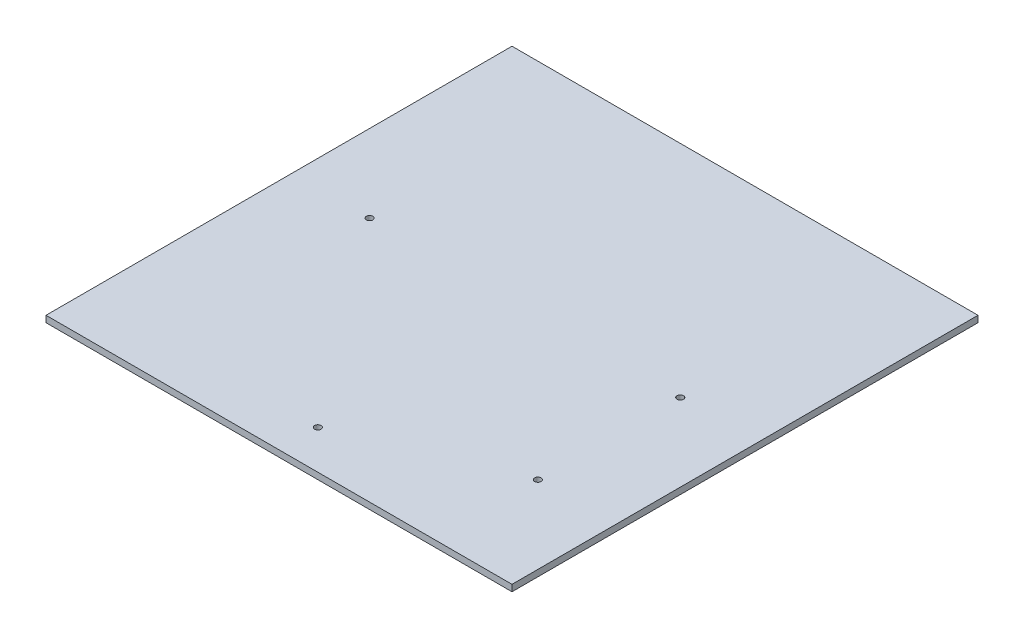
ISO-10303-21;
HEADER;
FILE_DESCRIPTION(('STEP AP214'),'2;1');
FILE_NAME('part.step','',(''),(''),'','','');
FILE_SCHEMA(('AUTOMOTIVE_DESIGN { 1 0 10303 214 1 1 1 1 }'));
ENDSEC;
DATA;
#1=APPLICATION_CONTEXT('core data for automotive mechanical design processes');
#2=APPLICATION_PROTOCOL_DEFINITION('international standard','automotive_design',2000,#1);
#3=PRODUCT_CONTEXT('',#1,'mechanical');
#4=PRODUCT('Part','Part','',(#3));
#5=PRODUCT_RELATED_PRODUCT_CATEGORY('part','',(#4));
#6=PRODUCT_DEFINITION_FORMATION('','',#4);
#7=PRODUCT_DEFINITION_CONTEXT('part definition',#1,'design');
#8=PRODUCT_DEFINITION('design','',#6,#7);
#9=PRODUCT_DEFINITION_SHAPE('','',#8);
#10=(LENGTH_UNIT() NAMED_UNIT(*) SI_UNIT(.MILLI.,.METRE.));
#11=(NAMED_UNIT(*) PLANE_ANGLE_UNIT() SI_UNIT($,.RADIAN.));
#12=(NAMED_UNIT(*) SI_UNIT($,.STERADIAN.) SOLID_ANGLE_UNIT());
#13=UNCERTAINTY_MEASURE_WITH_UNIT(LENGTH_MEASURE(1.E-05),#10,'distance_accuracy_value','');
#14=(GEOMETRIC_REPRESENTATION_CONTEXT(3) GLOBAL_UNCERTAINTY_ASSIGNED_CONTEXT((#13)) GLOBAL_UNIT_ASSIGNED_CONTEXT((#10,
#11,#12)) REPRESENTATION_CONTEXT('',''));
#15=CARTESIAN_POINT('',(0.,0.,0.));
#16=DIRECTION('',(0.,0.,1.));
#17=DIRECTION('',(1.,0.,0.));
#18=AXIS2_PLACEMENT_3D('',#15,#16,#17);
#19=CARTESIAN_POINT('',(457.2,12.7,457.2));
#20=DIRECTION('',(-1.,0.,0.));
#21=DIRECTION('',(0.,0.,1.));
#22=AXIS2_PLACEMENT_3D('',#19,#20,#21);
#23=PLANE('',#22);
#24=DIRECTION('',(0.,0.,-1.));
#25=VECTOR('',#24,1.);
#26=CARTESIAN_POINT('',(457.2,0.,457.2));
#27=LINE('',#26,#25);
#28=CARTESIAN_POINT('',(457.2,0.,457.2));
#29=VERTEX_POINT('',#28);
#30=CARTESIAN_POINT('',(457.2,0.,-457.2));
#31=VERTEX_POINT('',#30);
#32=EDGE_CURVE('E95',#29,#31,#27,.T.);
#33=ORIENTED_EDGE('',*,*,#32,.T.);
#34=DIRECTION('',(0.,-1.,0.));
#35=VECTOR('',#34,1.);
#36=CARTESIAN_POINT('',(457.2,12.7,-457.2));
#37=LINE('',#36,#35);
#38=CARTESIAN_POINT('',(457.2,12.7,-457.2));
#39=VERTEX_POINT('',#38);
#40=EDGE_CURVE('E11',#39,#31,#37,.T.);
#41=ORIENTED_EDGE('',*,*,#40,.F.);
#42=DIRECTION('',(0.,0.,-1.));
#43=VECTOR('',#42,1.);
#44=CARTESIAN_POINT('',(457.2,12.7,457.2));
#45=LINE('',#44,#43);
#46=CARTESIAN_POINT('',(457.2,12.7,457.2));
#47=VERTEX_POINT('',#46);
#48=EDGE_CURVE('E83',#47,#39,#45,.T.);
#49=ORIENTED_EDGE('',*,*,#48,.F.);
#50=DIRECTION('',(0.,-1.,0.));
#51=VECTOR('',#50,1.);
#52=CARTESIAN_POINT('',(457.2,12.7,457.2));
#53=LINE('',#52,#51);
#54=EDGE_CURVE('E91',#47,#29,#53,.T.);
#55=ORIENTED_EDGE('',*,*,#54,.T.);
#56=EDGE_LOOP('',(#33,#41,#49,#55));
#57=FACE_BOUND('',#56,.T.);
#58=ADVANCED_FACE('F32',(#57),#23,.F.);
#59=CARTESIAN_POINT('',(-457.2,12.7,-457.2));
#60=DIRECTION('',(0.,0.,1.));
#61=DIRECTION('',(1.,0.,0.));
#62=AXIS2_PLACEMENT_3D('',#59,#60,#61);
#63=PLANE('',#62);
#64=DIRECTION('',(-1.,0.,0.));
#65=VECTOR('',#64,1.);
#66=CARTESIAN_POINT('',(-457.2,0.,-457.2));
#67=LINE('',#66,#65);
#68=CARTESIAN_POINT('',(-457.2,0.,-457.2));
#69=VERTEX_POINT('',#68);
#70=EDGE_CURVE('E87',#31,#69,#67,.T.);
#71=ORIENTED_EDGE('',*,*,#70,.T.);
#72=DIRECTION('',(0.,-1.,0.));
#73=VECTOR('',#72,1.);
#74=CARTESIAN_POINT('',(-457.2,12.7,-457.2));
#75=LINE('',#74,#73);
#76=CARTESIAN_POINT('',(-457.2,12.7,-457.2));
#77=VERTEX_POINT('',#76);
#78=EDGE_CURVE('E40',#77,#69,#75,.T.);
#79=ORIENTED_EDGE('',*,*,#78,.F.);
#80=DIRECTION('',(-1.,0.,0.));
#81=VECTOR('',#80,1.);
#82=CARTESIAN_POINT('',(-457.2,12.7,-457.2));
#83=LINE('',#82,#81);
#84=EDGE_CURVE('E78',#39,#77,#83,.T.);
#85=ORIENTED_EDGE('',*,*,#84,.F.);
#86=ORIENTED_EDGE('',*,*,#40,.T.);
#87=EDGE_LOOP('',(#71,#79,#85,#86));
#88=FACE_BOUND('',#87,.T.);
#89=ADVANCED_FACE('F86',(#88),#63,.F.);
#90=CARTESIAN_POINT('',(-457.2,12.7,457.2));
#91=DIRECTION('',(1.,0.,0.));
#92=DIRECTION('',(0.,0.,-1.));
#93=AXIS2_PLACEMENT_3D('',#90,#91,#92);
#94=PLANE('',#93);
#95=DIRECTION('',(0.,0.,1.));
#96=VECTOR('',#95,1.);
#97=CARTESIAN_POINT('',(-457.2,0.,457.2));
#98=LINE('',#97,#96);
#99=CARTESIAN_POINT('',(-457.2,0.,457.2));
#100=VERTEX_POINT('',#99);
#101=EDGE_CURVE('E65',#69,#100,#98,.T.);
#102=ORIENTED_EDGE('',*,*,#101,.T.);
#103=DIRECTION('',(0.,-1.,0.));
#104=VECTOR('',#103,1.);
#105=CARTESIAN_POINT('',(-457.2,12.7,457.2));
#106=LINE('',#105,#104);
#107=CARTESIAN_POINT('',(-457.2,12.7,457.2));
#108=VERTEX_POINT('',#107);
#109=EDGE_CURVE('E88',#108,#100,#106,.T.);
#110=ORIENTED_EDGE('',*,*,#109,.F.);
#111=DIRECTION('',(0.,0.,1.));
#112=VECTOR('',#111,1.);
#113=CARTESIAN_POINT('',(-457.2,12.7,457.2));
#114=LINE('',#113,#112);
#115=EDGE_CURVE('E81',#77,#108,#114,.T.);
#116=ORIENTED_EDGE('',*,*,#115,.F.);
#117=ORIENTED_EDGE('',*,*,#78,.T.);
#118=EDGE_LOOP('',(#102,#110,#116,#117));
#119=FACE_BOUND('',#118,.T.);
#120=ADVANCED_FACE('F89',(#119),#94,.F.);
#121=CARTESIAN_POINT('',(-457.2,12.7,457.2));
#122=DIRECTION('',(0.,0.,-1.));
#123=DIRECTION('',(-1.,0.,0.));
#124=AXIS2_PLACEMENT_3D('',#121,#122,#123);
#125=PLANE('',#124);
#126=DIRECTION('',(1.,0.,0.));
#127=VECTOR('',#126,1.);
#128=CARTESIAN_POINT('',(-457.2,0.,457.2));
#129=LINE('',#128,#127);
#130=EDGE_CURVE('E71',#100,#29,#129,.T.);
#131=ORIENTED_EDGE('',*,*,#130,.T.);
#132=ORIENTED_EDGE('',*,*,#54,.F.);
#133=DIRECTION('',(1.,0.,0.));
#134=VECTOR('',#133,1.);
#135=CARTESIAN_POINT('',(-457.2,12.7,457.2));
#136=LINE('',#135,#134);
#137=EDGE_CURVE('E48',#108,#47,#136,.T.);
#138=ORIENTED_EDGE('',*,*,#137,.F.);
#139=ORIENTED_EDGE('',*,*,#109,.T.);
#140=EDGE_LOOP('',(#131,#132,#138,#139));
#141=FACE_BOUND('',#140,.T.);
#142=ADVANCED_FACE('F103',(#141),#125,.F.);
#143=CARTESIAN_POINT('',(0.,12.7,0.));
#144=DIRECTION('',(0.,-1.,0.));
#145=DIRECTION('',(0.,0.,-1.));
#146=AXIS2_PLACEMENT_3D('',#143,#144,#145);
#147=PLANE('',#146);
#148=CARTESIAN_POINT('',(-304.8,12.7,-25.4));
#149=DIRECTION('',(0.,1.,0.));
#150=DIRECTION('',(0.,0.,1.));
#151=AXIS2_PLACEMENT_3D('',#148,#149,#150);
#152=CIRCLE('',#151,6.35);
#153=CARTESIAN_POINT('',(-304.8,12.7,-19.05));
#154=VERTEX_POINT('',#153);
#155=EDGE_CURVE('E127',#154,#154,#152,.T.);
#156=ORIENTED_EDGE('',*,*,#155,.F.);
#157=EDGE_LOOP('',(#156));
#158=FACE_BOUND('',#157,.T.);
#159=CARTESIAN_POINT('',(304.8,12.7,-25.4));
#160=DIRECTION('',(0.,1.,0.));
#161=DIRECTION('',(0.,0.,1.));
#162=AXIS2_PLACEMENT_3D('',#159,#160,#161);
#163=CIRCLE('',#162,6.35);
#164=CARTESIAN_POINT('',(304.8,12.7,-19.05));
#165=VERTEX_POINT('',#164);
#166=EDGE_CURVE('E121',#165,#165,#163,.T.);
#167=ORIENTED_EDGE('',*,*,#166,.F.);
#168=EDGE_LOOP('',(#167));
#169=FACE_BOUND('',#168,.T.);
#170=CARTESIAN_POINT('',(304.8,12.7,254.));
#171=DIRECTION('',(0.,1.,0.));
#172=DIRECTION('',(0.,0.,1.));
#173=AXIS2_PLACEMENT_3D('',#170,#171,#172);
#174=CIRCLE('',#173,6.34999999999994);
#175=CARTESIAN_POINT('',(304.8,12.7,260.35));
#176=VERTEX_POINT('',#175);
#177=EDGE_CURVE('E115',#176,#176,#174,.T.);
#178=ORIENTED_EDGE('',*,*,#177,.F.);
#179=EDGE_LOOP('',(#178));
#180=FACE_BOUND('',#179,.T.);
#181=CARTESIAN_POINT('',(0.,12.7,381.));
#182=DIRECTION('',(0.,1.,0.));
#183=DIRECTION('',(0.,0.,1.));
#184=AXIS2_PLACEMENT_3D('',#181,#182,#183);
#185=CIRCLE('',#184,6.35);
#186=CARTESIAN_POINT('',(0.,12.7,387.35));
#187=VERTEX_POINT('',#186);
#188=EDGE_CURVE('E109',#187,#187,#185,.T.);
#189=ORIENTED_EDGE('',*,*,#188,.F.);
#190=EDGE_LOOP('',(#189));
#191=FACE_BOUND('',#190,.T.);
#192=ORIENTED_EDGE('',*,*,#48,.T.);
#193=ORIENTED_EDGE('',*,*,#84,.T.);
#194=ORIENTED_EDGE('',*,*,#115,.T.);
#195=ORIENTED_EDGE('',*,*,#137,.T.);
#196=EDGE_LOOP('',(#192,#193,#194,#195));
#197=FACE_BOUND('',#196,.T.);
#198=ADVANCED_FACE('F79',(#158,#169,#180,#191,#197),#147,.F.);
#199=CARTESIAN_POINT('',(0.,0.,0.));
#200=DIRECTION('',(0.,-1.,0.));
#201=DIRECTION('',(0.,0.,-1.));
#202=AXIS2_PLACEMENT_3D('',#199,#200,#201);
#203=PLANE('',#202);
#204=CARTESIAN_POINT('',(-304.8,0.,-25.4));
#205=DIRECTION('',(0.,1.,0.));
#206=DIRECTION('',(0.,0.,1.));
#207=AXIS2_PLACEMENT_3D('',#204,#205,#206);
#208=CIRCLE('',#207,6.35);
#209=CARTESIAN_POINT('',(-304.8,0.,-19.05));
#210=VERTEX_POINT('',#209);
#211=EDGE_CURVE('E124',#210,#210,#208,.T.);
#212=ORIENTED_EDGE('',*,*,#211,.T.);
#213=EDGE_LOOP('',(#212));
#214=FACE_BOUND('',#213,.T.);
#215=CARTESIAN_POINT('',(304.8,0.,-25.4));
#216=DIRECTION('',(0.,1.,0.));
#217=DIRECTION('',(0.,0.,1.));
#218=AXIS2_PLACEMENT_3D('',#215,#216,#217);
#219=CIRCLE('',#218,6.35);
#220=CARTESIAN_POINT('',(304.8,0.,-19.05));
#221=VERTEX_POINT('',#220);
#222=EDGE_CURVE('E118',#221,#221,#219,.T.);
#223=ORIENTED_EDGE('',*,*,#222,.T.);
#224=EDGE_LOOP('',(#223));
#225=FACE_BOUND('',#224,.T.);
#226=CARTESIAN_POINT('',(304.8,0.,254.));
#227=DIRECTION('',(0.,1.,0.));
#228=DIRECTION('',(0.,0.,1.));
#229=AXIS2_PLACEMENT_3D('',#226,#227,#228);
#230=CIRCLE('',#229,6.34999999999994);
#231=CARTESIAN_POINT('',(304.8,0.,260.35));
#232=VERTEX_POINT('',#231);
#233=EDGE_CURVE('E112',#232,#232,#230,.T.);
#234=ORIENTED_EDGE('',*,*,#233,.T.);
#235=EDGE_LOOP('',(#234));
#236=FACE_BOUND('',#235,.T.);
#237=CARTESIAN_POINT('',(0.,0.,381.));
#238=DIRECTION('',(0.,1.,0.));
#239=DIRECTION('',(0.,0.,1.));
#240=AXIS2_PLACEMENT_3D('',#237,#238,#239);
#241=CIRCLE('',#240,6.35);
#242=CARTESIAN_POINT('',(0.,0.,387.35));
#243=VERTEX_POINT('',#242);
#244=EDGE_CURVE('E98',#243,#243,#241,.T.);
#245=ORIENTED_EDGE('',*,*,#244,.T.);
#246=EDGE_LOOP('',(#245));
#247=FACE_BOUND('',#246,.T.);
#248=ORIENTED_EDGE('',*,*,#32,.F.);
#249=ORIENTED_EDGE('',*,*,#130,.F.);
#250=ORIENTED_EDGE('',*,*,#101,.F.);
#251=ORIENTED_EDGE('',*,*,#70,.F.);
#252=EDGE_LOOP('',(#248,#249,#250,#251));
#253=FACE_BOUND('',#252,.T.);
#254=ADVANCED_FACE('F106',(#214,#225,#236,#247,#253),#203,.T.);
#255=CARTESIAN_POINT('',(0.,0.,381.));
#256=DIRECTION('',(0.,1.,0.));
#257=DIRECTION('',(0.,0.,1.));
#258=AXIS2_PLACEMENT_3D('',#255,#256,#257);
#259=CYLINDRICAL_SURFACE('',#258,6.35);
#260=ORIENTED_EDGE('',*,*,#244,.F.);
#261=EDGE_LOOP('',(#260));
#262=FACE_BOUND('',#261,.T.);
#263=ORIENTED_EDGE('',*,*,#188,.T.);
#264=EDGE_LOOP('',(#263));
#265=FACE_BOUND('',#264,.T.);
#266=ADVANCED_FACE('F151',(#262,#265),#259,.F.);
#267=CARTESIAN_POINT('',(304.8,0.,254.));
#268=DIRECTION('',(0.,1.,0.));
#269=DIRECTION('',(0.,0.,1.));
#270=AXIS2_PLACEMENT_3D('',#267,#268,#269);
#271=CYLINDRICAL_SURFACE('',#270,6.34999999999994);
#272=ORIENTED_EDGE('',*,*,#233,.F.);
#273=EDGE_LOOP('',(#272));
#274=FACE_BOUND('',#273,.T.);
#275=ORIENTED_EDGE('',*,*,#177,.T.);
#276=EDGE_LOOP('',(#275));
#277=FACE_BOUND('',#276,.T.);
#278=ADVANCED_FACE('F153',(#274,#277),#271,.F.);
#279=CARTESIAN_POINT('',(304.8,0.,-25.4));
#280=DIRECTION('',(0.,1.,0.));
#281=DIRECTION('',(0.,0.,1.));
#282=AXIS2_PLACEMENT_3D('',#279,#280,#281);
#283=CYLINDRICAL_SURFACE('',#282,6.35);
#284=ORIENTED_EDGE('',*,*,#222,.F.);
#285=EDGE_LOOP('',(#284));
#286=FACE_BOUND('',#285,.T.);
#287=ORIENTED_EDGE('',*,*,#166,.T.);
#288=EDGE_LOOP('',(#287));
#289=FACE_BOUND('',#288,.T.);
#290=ADVANCED_FACE('F138',(#286,#289),#283,.F.);
#291=CARTESIAN_POINT('',(-304.8,0.,-25.4));
#292=DIRECTION('',(0.,1.,0.));
#293=DIRECTION('',(0.,0.,1.));
#294=AXIS2_PLACEMENT_3D('',#291,#292,#293);
#295=CYLINDRICAL_SURFACE('',#294,6.35);
#296=ORIENTED_EDGE('',*,*,#211,.F.);
#297=EDGE_LOOP('',(#296));
#298=FACE_BOUND('',#297,.T.);
#299=ORIENTED_EDGE('',*,*,#155,.T.);
#300=EDGE_LOOP('',(#299));
#301=FACE_BOUND('',#300,.T.);
#302=ADVANCED_FACE('F135',(#298,#301),#295,.F.);
#303=CLOSED_SHELL('',(#58,#89,#120,#142,#198,#254,#266,#278,#290,#302));
#304=MANIFOLD_SOLID_BREP('B2',#303);
#305=ADVANCED_BREP_SHAPE_REPRESENTATION('',(#18,#304),#14);
#306=SHAPE_DEFINITION_REPRESENTATION(#9,#305);
ENDSEC;
END-ISO-10303-21;
